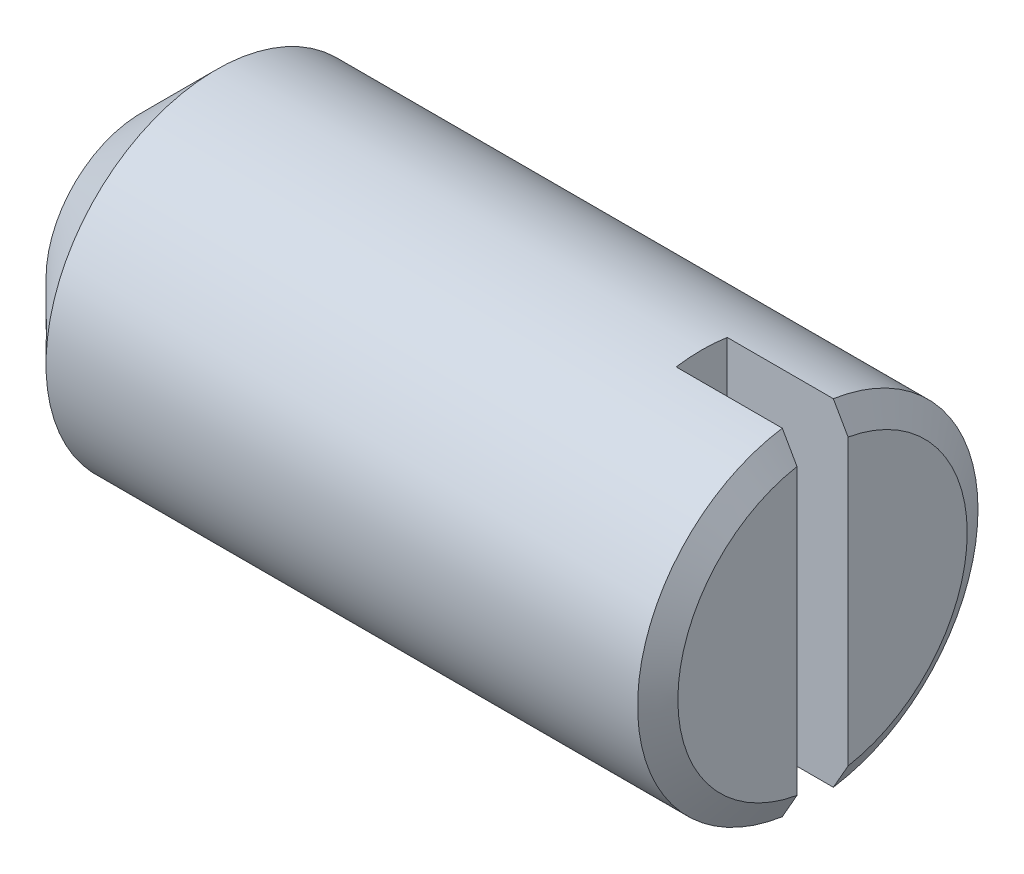
ISO-10303-21;
HEADER;
FILE_DESCRIPTION(('STEP AP214'),'2;1');
FILE_NAME('part.step','',(''),(''),'','','');
FILE_SCHEMA(('AUTOMOTIVE_DESIGN { 1 0 10303 214 1 1 1 1 }'));
ENDSEC;
DATA;
#1=APPLICATION_CONTEXT('core data for automotive mechanical design processes');
#2=APPLICATION_PROTOCOL_DEFINITION('international standard','automotive_design',2000,#1);
#3=PRODUCT_CONTEXT('',#1,'mechanical');
#4=PRODUCT('Part','Part','',(#3));
#5=PRODUCT_RELATED_PRODUCT_CATEGORY('part','',(#4));
#6=PRODUCT_DEFINITION_FORMATION('','',#4);
#7=PRODUCT_DEFINITION_CONTEXT('part definition',#1,'design');
#8=PRODUCT_DEFINITION('design','',#6,#7);
#9=PRODUCT_DEFINITION_SHAPE('','',#8);
#10=(LENGTH_UNIT() NAMED_UNIT(*) SI_UNIT(.MILLI.,.METRE.));
#11=(NAMED_UNIT(*) PLANE_ANGLE_UNIT() SI_UNIT($,.RADIAN.));
#12=(NAMED_UNIT(*) SI_UNIT($,.STERADIAN.) SOLID_ANGLE_UNIT());
#13=UNCERTAINTY_MEASURE_WITH_UNIT(LENGTH_MEASURE(1.E-05),#10,'distance_accuracy_value','');
#14=(GEOMETRIC_REPRESENTATION_CONTEXT(3) GLOBAL_UNCERTAINTY_ASSIGNED_CONTEXT((#13)) GLOBAL_UNIT_ASSIGNED_CONTEXT((#10,
#11,#12)) REPRESENTATION_CONTEXT('',''));
#15=CARTESIAN_POINT('',(0.,0.,0.));
#16=DIRECTION('',(0.,0.,1.));
#17=DIRECTION('',(1.,0.,0.));
#18=AXIS2_PLACEMENT_3D('',#15,#16,#17);
#19=CARTESIAN_POINT('',(8.,0.,0.));
#20=DIRECTION('',(-1.,0.,0.));
#21=DIRECTION('',(0.,0.,1.));
#22=AXIS2_PLACEMENT_3D('',#19,#20,#21);
#23=CONICAL_SURFACE('',#22,1.7,1.04719755119659);
#24=CARTESIAN_POINT('',(6.43384577443204,4.40244894630011,0.299999999999992));
#25=CARTESIAN_POINT('',(6.54099986398286,4.21641536933403,0.299999999999993));
#26=CARTESIAN_POINT('',(6.64813596929299,4.03037142123298,0.299999999999993));
#27=CARTESIAN_POINT('',(6.86233649699623,3.6582410423436,0.299999999999994));
#28=CARTESIAN_POINT('',(6.96940091903233,3.47215461134977,0.299999999999995));
#29=CARTESIAN_POINT('',(7.18340645502229,3.09994519405125,0.299999999999996));
#30=CARTESIAN_POINT('',(7.29034758402646,2.91382221640337,0.299999999999996));
#31=CARTESIAN_POINT('',(7.50403787499869,2.54146710787707,0.299999999999997));
#32=CARTESIAN_POINT('',(7.61078703776045,2.35523497745418,0.299999999999998));
#33=CARTESIAN_POINT('',(7.82309426396742,1.98402598556893,0.299999999999999));
#34=CARTESIAN_POINT('',(7.92865510791797,1.79905071693742,0.299999999999999));
#35=CARTESIAN_POINT('',(8.08636037949641,1.52120965777465,0.3));
#36=CARTESIAN_POINT('',(8.1388262889448,1.42852673941122,0.3));
#37=CARTESIAN_POINT('',(8.243367594063,1.24294434814013,0.300000000000001));
#38=CARTESIAN_POINT('',(8.29544299951034,1.15004488073133,0.300000000000001));
#39=CARTESIAN_POINT('',(8.39902801053093,0.963584343852958,0.300000000000002));
#40=CARTESIAN_POINT('',(8.45053561068544,0.870022148124238,0.300000000000002));
#41=CARTESIAN_POINT('',(8.52647655275933,0.728971609484221,0.300000000000002));
#42=CARTESIAN_POINT('',(8.5515690573268,0.681838961785801,0.300000000000002));
#43=CARTESIAN_POINT('',(8.60098924091676,0.587177617069353,0.300000000000002));
#44=CARTESIAN_POINT('',(8.62531702474956,0.539648975464611,0.300000000000003));
#45=CARTESIAN_POINT('',(8.66082604510436,0.467590225669644,0.300000000000003));
#46=CARTESIAN_POINT('',(8.67255043924786,0.443329175234501,0.300000000000003));
#47=CARTESIAN_POINT('',(8.6954497341713,0.394550260257357,0.300000000000003));
#48=CARTESIAN_POINT('',(8.70662467543611,0.370032414798532,0.300000000000003));
#49=CARTESIAN_POINT('',(8.72818404469195,0.320568263408581,0.300000000000003));
#50=CARTESIAN_POINT('',(8.73856634298754,0.29562100964,0.300000000000003));
#51=CARTESIAN_POINT('',(8.75804469462508,0.245239943278828,0.300000000000003));
#52=CARTESIAN_POINT('',(8.76714117598854,0.219806295812293,0.300000000000003));
#53=CARTESIAN_POINT('',(8.78574944940381,0.160440993195013,0.300000000000003));
#54=CARTESIAN_POINT('',(8.79455589633127,0.126264122572378,0.300000000000003));
#55=CARTESIAN_POINT('',(8.80329578205414,0.0743921980619298,0.300000000000003));
#56=CARTESIAN_POINT('',(8.80546423348747,0.0570819807733824,0.300000000000003));
#57=CARTESIAN_POINT('',(8.80809548406505,0.022331407032104,0.300000000000003));
#58=CARTESIAN_POINT('',(8.80855877140002,0.00489108926039829,0.300000000000003));
#59=CARTESIAN_POINT('',(8.80771899321109,-0.029991484685728,0.300000000000003));
#60=CARTESIAN_POINT('',(8.80641122145873,-0.0474336223868381,0.300000000000003));
#61=CARTESIAN_POINT('',(8.80218582178616,-0.0821235099255909,0.300000000000003));
#62=CARTESIAN_POINT('',(8.79926736028687,-0.0993711543869434,0.300000000000003));
#63=CARTESIAN_POINT('',(8.79207945037896,-0.133777027234762,0.300000000000003));
#64=CARTESIAN_POINT('',(8.7877951879204,-0.150932072423952,0.300000000000003));
#65=CARTESIAN_POINT('',(8.77820108928469,-0.184946222304824,0.300000000000003));
#66=CARTESIAN_POINT('',(8.77289127583489,-0.201805333545701,0.300000000000003));
#67=CARTESIAN_POINT('',(8.75484530489759,-0.254925171469467,0.300000000000003));
#68=CARTESIAN_POINT('',(8.74071441973956,-0.290705223590161,0.300000000000003));
#69=CARTESIAN_POINT('',(8.71062400242476,-0.361494745894207,0.300000000000003));
#70=CARTESIAN_POINT('',(8.69466250278299,-0.396503337856948,0.300000000000003));
#71=CARTESIAN_POINT('',(8.66166899240292,-0.466113002783628,0.300000000000003));
#72=CARTESIAN_POINT('',(8.64463452397595,-0.500712907385385,0.300000000000002));
#73=CARTESIAN_POINT('',(8.60993890010029,-0.569598273931734,0.300000000000002));
#74=CARTESIAN_POINT('',(8.5922776770247,-0.603883701438852,0.300000000000002));
#75=CARTESIAN_POINT('',(8.53859664435761,-0.706644547549245,0.300000000000002));
#76=CARTESIAN_POINT('',(8.50198532248893,-0.774810057875359,0.300000000000002));
#77=CARTESIAN_POINT('',(8.4280979388698,-0.910626011246942,0.300000000000001));
#78=CARTESIAN_POINT('',(8.39082310494904,-0.978277130015775,0.300000000000001));
#79=CARTESIAN_POINT('',(8.31369052620455,-1.11726496030411,0.300000000000001));
#80=CARTESIAN_POINT('',(8.27380827261231,-1.18858807897555,0.3));
#81=CARTESIAN_POINT('',(8.19377418393951,-1.33108241039772,0.3));
#82=CARTESIAN_POINT('',(8.15362234900318,-1.40225362322971,0.3));
#83=CARTESIAN_POINT('',(8.03291197029119,-1.61562845677563,0.299999999999999));
#84=CARTESIAN_POINT('',(7.95210086275345,-1.7576891435005,0.299999999999998));
#85=CARTESIAN_POINT('',(7.79010047747201,-2.04174752172152,0.299999999999998));
#86=CARTESIAN_POINT('',(7.70891094549143,-2.18374506786865,0.299999999999997));
#87=CARTESIAN_POINT('',(7.54635364086865,-2.46763597612371,0.299999999999996));
#88=CARTESIAN_POINT('',(7.46498587026365,-2.60952933939791,0.299999999999996));
#89=CARTESIAN_POINT('',(7.30451857599533,-2.88911302620783,0.299999999999995));
#90=CARTESIAN_POINT('',(7.22542216939588,-3.02680513982857,0.299999999999994));
#91=CARTESIAN_POINT('',(7.06716086832774,-3.30215069522887,0.299999999999994));
#92=CARTESIAN_POINT('',(6.98799597360091,-3.43980413686005,0.299999999999993));
#93=CARTESIAN_POINT('',(6.82968603599213,-3.71496754148606,0.299999999999992));
#94=CARTESIAN_POINT('',(6.75054103291849,-3.85247752738738,0.299999999999992));
#95=CARTESIAN_POINT('',(6.59221641549057,-4.12747684994086,0.299999999999991));
#96=CARTESIAN_POINT('',(6.51303680127426,-4.26496618667245,0.29999999999999));
#97=CARTESIAN_POINT('',(6.43384577443204,-4.40244894630011,0.29999999999999));
#98=B_SPLINE_CURVE_WITH_KNOTS('',3,(#24,#25,#26,#27,#28,#29,#30,#31,#32,#33,#34,#35,#36,#37,#38,
#39,#40,#41,#42,#43,#44,#45,#46,#47,#48,#49,#50,#51,#52,#53,#54,#55,#56,#57,#58,#59,#60,#61,#62,
#63,#64,#65,#66,#67,#68,#69,#70,#71,#72,#73,#74,#75,#76,#77,#78,#79,#80,#81,#82,#83,#84,#85,#86,
#87,#88,#89,#90,#91,#92,#93,#94,#95,#96,#97),.UNSPECIFIED.,.F.,.F.,(4,2,2,2,2,2,2,2,2,2,2,2,2,2,
2,2,2,2,2,2,2,2,2,2,2,2,2,2,2,2,2,2,2,2,2,2,4),(0.,0.644060892388608,1.28812496899202,
1.93209966475453,2.57607169180933,3.21499990646721,3.5345067171213,3.85400550099236,
4.17440368691128,4.33458879688482,4.49475185579147,4.57558345391017,4.65640908722862,
4.73744475464583,4.818453383141,4.92394468881427,4.97620855608451,5.0284574589765,
5.08084547545169,5.13326062971658,5.18626483524194,5.23926786627027,5.35455329205823,
5.46996380498466,5.58564902795616,5.70134677155788,5.93345956010062,6.1651801211014,
6.41032815199519,6.65547605174483,7.14578604513707,7.63649505432983,8.12719848390084,
8.60357881679363,9.07996095302559,9.55594030637969,10.031917779299),.UNSPECIFIED.);
#99=CARTESIAN_POINT('',(7.82679491924311,1.97737199332852,0.299999999999999));
#100=VERTEX_POINT('',#99);
#101=CARTESIAN_POINT('',(8.,1.67332005306815,0.3));
#102=VERTEX_POINT('',#101);
#103=EDGE_CURVE('E104',#100,#102,#98,.T.);
#104=ORIENTED_EDGE('',*,*,#103,.F.);
#105=CARTESIAN_POINT('',(7.82679491924311,0.,0.));
#106=DIRECTION('',(1.,0.,0.));
#107=DIRECTION('',(0.,0.,-1.));
#108=AXIS2_PLACEMENT_3D('',#105,#106,#107);
#109=CIRCLE('',#108,2.);
#110=CARTESIAN_POINT('',(7.82679491924311,-1.97737199332852,0.299999999999998));
#111=VERTEX_POINT('',#110);
#112=EDGE_CURVE('E109',#100,#111,#109,.T.);
#113=ORIENTED_EDGE('',*,*,#112,.T.);
#114=CARTESIAN_POINT('',(8.,-1.67332005306815,0.299999999999999));
#115=VERTEX_POINT('',#114);
#116=EDGE_CURVE('E149',#115,#111,#98,.T.);
#117=ORIENTED_EDGE('',*,*,#116,.F.);
#118=CARTESIAN_POINT('',(8.,0.,0.));
#119=DIRECTION('',(1.,0.,0.));
#120=DIRECTION('',(0.,0.,-1.));
#121=AXIS2_PLACEMENT_3D('',#118,#119,#120);
#122=CIRCLE('',#121,1.7);
#123=EDGE_CURVE('E101',#102,#115,#122,.T.);
#124=ORIENTED_EDGE('',*,*,#123,.F.);
#125=EDGE_LOOP('',(#104,#113,#117,#124));
#126=FACE_BOUND('',#125,.T.);
#127=ADVANCED_FACE('F29',(#126),#23,.T.);
#128=CARTESIAN_POINT('',(8.,0.,-1.7));
#129=DIRECTION('',(1.,0.,0.));
#130=DIRECTION('',(0.,0.,-1.));
#131=AXIS2_PLACEMENT_3D('',#128,#129,#130);
#132=PLANE('',#131);
#133=DIRECTION('',(0.,-1.,0.));
#134=VECTOR('',#133,1.);
#135=CARTESIAN_POINT('',(8.,0.,0.299999999999999));
#136=LINE('',#135,#134);
#137=EDGE_CURVE('E88',#102,#115,#136,.T.);
#138=ORIENTED_EDGE('',*,*,#137,.F.);
#139=ORIENTED_EDGE('',*,*,#123,.T.);
#140=EDGE_LOOP('',(#138,#139));
#141=FACE_BOUND('',#140,.T.);
#142=ADVANCED_FACE('F158',(#141),#132,.T.);
#143=CARTESIAN_POINT('',(0.,0.,0.));
#144=DIRECTION('',(-1.,0.,0.));
#145=DIRECTION('',(0.,0.,1.));
#146=AXIS2_PLACEMENT_3D('',#143,#144,#145);
#147=PLANE('',#146);
#148=CARTESIAN_POINT('',(0.,0.,0.));
#149=DIRECTION('',(1.,0.,0.));
#150=DIRECTION('',(0.,0.,-1.));
#151=AXIS2_PLACEMENT_3D('',#148,#149,#150);
#152=CIRCLE('',#151,1.125);
#153=CARTESIAN_POINT('',(0.,0.,-1.125));
#154=VERTEX_POINT('',#153);
#155=EDGE_CURVE('E89',#154,#154,#152,.T.);
#156=ORIENTED_EDGE('',*,*,#155,.F.);
#157=EDGE_LOOP('',(#156));
#158=FACE_BOUND('',#157,.T.);
#159=ADVANCED_FACE('F31',(#158),#147,.T.);
#160=CARTESIAN_POINT('',(0.875000000000009,0.,0.));
#161=DIRECTION('',(1.,0.,0.));
#162=DIRECTION('',(0.,0.,-1.));
#163=AXIS2_PLACEMENT_3D('',#160,#161,#162);
#164=CONICAL_SURFACE('',#163,2.,0.785398163397443);
#165=ORIENTED_EDGE('',*,*,#155,.T.);
#166=EDGE_LOOP('',(#165));
#167=FACE_BOUND('',#166,.T.);
#168=CARTESIAN_POINT('',(0.875000000000009,0.,0.));
#169=DIRECTION('',(1.,0.,0.));
#170=DIRECTION('',(0.,0.,-1.));
#171=AXIS2_PLACEMENT_3D('',#168,#169,#170);
#172=CIRCLE('',#171,2.);
#173=CARTESIAN_POINT('',(0.875000000000009,0.,-2.));
#174=VERTEX_POINT('',#173);
#175=EDGE_CURVE('E110',#174,#174,#172,.T.);
#176=ORIENTED_EDGE('',*,*,#175,.F.);
#177=EDGE_LOOP('',(#176));
#178=FACE_BOUND('',#177,.T.);
#179=ADVANCED_FACE('F170',(#167,#178),#164,.T.);
#180=CARTESIAN_POINT('',(8.,0.,0.));
#181=DIRECTION('',(1.,0.,0.));
#182=DIRECTION('',(0.,0.,-1.));
#183=AXIS2_PLACEMENT_3D('',#180,#181,#182);
#184=CYLINDRICAL_SURFACE('',#183,2.);
#185=DIRECTION('',(1.,0.,0.));
#186=VECTOR('',#185,1.);
#187=CARTESIAN_POINT('',(8.,-1.97737199332852,0.299999999999999));
#188=LINE('',#187,#186);
#189=CARTESIAN_POINT('',(6.58,-1.97737199332852,0.299999999999991));
#190=VERTEX_POINT('',#189);
#191=EDGE_CURVE('E129',#111,#190,#188,.F.);
#192=ORIENTED_EDGE('',*,*,#191,.F.);
#193=ORIENTED_EDGE('',*,*,#112,.F.);
#194=DIRECTION('',(1.,0.,0.));
#195=VECTOR('',#194,1.);
#196=CARTESIAN_POINT('',(8.,1.97737199332852,0.3));
#197=LINE('',#196,#195);
#198=CARTESIAN_POINT('',(6.58,1.97737199332852,0.299999999999992));
#199=VERTEX_POINT('',#198);
#200=EDGE_CURVE('E52',#199,#100,#197,.T.);
#201=ORIENTED_EDGE('',*,*,#200,.F.);
#202=CARTESIAN_POINT('',(6.58,0.,0.));
#203=DIRECTION('',(1.,0.,0.));
#204=DIRECTION('',(0.,0.,-1.));
#205=AXIS2_PLACEMENT_3D('',#202,#203,#204);
#206=CIRCLE('',#205,2.);
#207=CARTESIAN_POINT('',(6.58,1.97737199332852,-0.300000000000008));
#208=VERTEX_POINT('',#207);
#209=EDGE_CURVE('E33',#199,#208,#206,.F.);
#210=ORIENTED_EDGE('',*,*,#209,.T.);
#211=DIRECTION('',(1.,0.,0.));
#212=VECTOR('',#211,1.);
#213=CARTESIAN_POINT('',(8.,1.97737199332852,-0.3));
#214=LINE('',#213,#212);
#215=CARTESIAN_POINT('',(7.82679491924311,1.97737199332852,-0.300000000000001));
#216=VERTEX_POINT('',#215);
#217=EDGE_CURVE('E97',#216,#208,#214,.F.);
#218=ORIENTED_EDGE('',*,*,#217,.F.);
#219=CARTESIAN_POINT('',(7.82679491924311,-1.97737199332852,-0.300000000000001));
#220=VERTEX_POINT('',#219);
#221=EDGE_CURVE('E96',#220,#216,#109,.T.);
#222=ORIENTED_EDGE('',*,*,#221,.F.);
#223=DIRECTION('',(1.,0.,0.));
#224=VECTOR('',#223,1.);
#225=CARTESIAN_POINT('',(8.,-1.97737199332852,-0.3));
#226=LINE('',#225,#224);
#227=CARTESIAN_POINT('',(6.58,-1.97737199332852,-0.300000000000008));
#228=VERTEX_POINT('',#227);
#229=EDGE_CURVE('E153',#228,#220,#226,.T.);
#230=ORIENTED_EDGE('',*,*,#229,.F.);
#231=EDGE_CURVE('E11',#228,#190,#206,.F.);
#232=ORIENTED_EDGE('',*,*,#231,.T.);
#233=EDGE_LOOP('',(#192,#193,#201,#210,#218,#222,#230,#232));
#234=FACE_BOUND('',#233,.T.);
#235=ORIENTED_EDGE('',*,*,#175,.T.);
#236=EDGE_LOOP('',(#235));
#237=FACE_BOUND('',#236,.T.);
#238=ADVANCED_FACE('F119',(#234,#237),#184,.T.);
#239=CARTESIAN_POINT('',(6.43384577443204,-4.40244894630011,-0.300000000000008));
#240=CARTESIAN_POINT('',(6.54099986398286,-4.21641536933403,-0.300000000000008));
#241=CARTESIAN_POINT('',(6.64813596929298,-4.03037142123299,-0.300000000000007));
#242=CARTESIAN_POINT('',(6.86233649699623,-3.6582410423436,-0.300000000000006));
#243=CARTESIAN_POINT('',(6.96940091903232,-3.47215461134978,-0.300000000000006));
#244=CARTESIAN_POINT('',(7.18340645502228,-3.09994519405126,-0.300000000000005));
#245=CARTESIAN_POINT('',(7.29034758402645,-2.91382221640338,-0.300000000000004));
#246=CARTESIAN_POINT('',(7.50403787499868,-2.54146710787708,-0.300000000000003));
#247=CARTESIAN_POINT('',(7.61078703776044,-2.3552349774542,-0.300000000000002));
#248=CARTESIAN_POINT('',(7.82309426396741,-1.98402598556895,-0.300000000000001));
#249=CARTESIAN_POINT('',(7.92865510791796,-1.79905071693744,-0.300000000000001));
#250=CARTESIAN_POINT('',(8.0863603794964,-1.52120965777466,-0.3));
#251=CARTESIAN_POINT('',(8.1388262889448,-1.42852673941124,-0.3));
#252=CARTESIAN_POINT('',(8.24336759406299,-1.24294434814014,-0.299999999999999));
#253=CARTESIAN_POINT('',(8.29544299951033,-1.15004488073134,-0.299999999999999));
#254=CARTESIAN_POINT('',(8.39902801053093,-0.963584343852968,-0.299999999999998));
#255=CARTESIAN_POINT('',(8.45053561068544,-0.870022148124248,-0.299999999999998));
#256=CARTESIAN_POINT('',(8.52647655275933,-0.72897160948423,-0.299999999999997));
#257=CARTESIAN_POINT('',(8.5515690573268,-0.681838961785811,-0.299999999999997));
#258=CARTESIAN_POINT('',(8.60098924091676,-0.587177617069363,-0.299999999999997));
#259=CARTESIAN_POINT('',(8.62531702474956,-0.539648975464621,-0.299999999999997));
#260=CARTESIAN_POINT('',(8.66082604510436,-0.467590225669654,-0.299999999999997));
#261=CARTESIAN_POINT('',(8.67255043924786,-0.443329175234511,-0.299999999999997));
#262=CARTESIAN_POINT('',(8.6954497341713,-0.394550260257367,-0.299999999999997));
#263=CARTESIAN_POINT('',(8.70662467543611,-0.370032414798542,-0.299999999999997));
#264=CARTESIAN_POINT('',(8.72818404469195,-0.32056826340859,-0.299999999999996));
#265=CARTESIAN_POINT('',(8.73856634298754,-0.295621009640009,-0.299999999999996));
#266=CARTESIAN_POINT('',(8.75804469462508,-0.245239943278837,-0.299999999999996));
#267=CARTESIAN_POINT('',(8.76714117598854,-0.219806295812302,-0.299999999999996));
#268=CARTESIAN_POINT('',(8.78574944940381,-0.160440993195022,-0.299999999999996));
#269=CARTESIAN_POINT('',(8.79455589633128,-0.126264122572388,-0.299999999999996));
#270=CARTESIAN_POINT('',(8.80329578205415,-0.0743921980619397,-0.299999999999996));
#271=CARTESIAN_POINT('',(8.80546423348748,-0.0570819807733928,-0.299999999999996));
#272=CARTESIAN_POINT('',(8.80809548406506,-0.0223314070321156,-0.299999999999996));
#273=CARTESIAN_POINT('',(8.80855877140003,-0.00489108926041064,-0.299999999999996));
#274=CARTESIAN_POINT('',(8.8077189932111,0.0299914846857147,-0.299999999999996));
#275=CARTESIAN_POINT('',(8.80641122145874,0.0474336223868245,-0.299999999999996));
#276=CARTESIAN_POINT('',(8.80218582178616,0.0821235099255769,-0.299999999999996));
#277=CARTESIAN_POINT('',(8.79926736028688,0.0993711543869292,-0.299999999999996));
#278=CARTESIAN_POINT('',(8.79207945037897,0.133777027234748,-0.299999999999996));
#279=CARTESIAN_POINT('',(8.78779518792041,0.150932072423937,-0.299999999999996));
#280=CARTESIAN_POINT('',(8.7782010892847,0.18494622230481,-0.299999999999996));
#281=CARTESIAN_POINT('',(8.7728912758349,0.201805333545686,-0.299999999999996));
#282=CARTESIAN_POINT('',(8.7548453048976,0.254925171469449,-0.299999999999996));
#283=CARTESIAN_POINT('',(8.74071441973957,0.290705223590141,-0.299999999999996));
#284=CARTESIAN_POINT('',(8.71062400242477,0.361494745894183,-0.299999999999996));
#285=CARTESIAN_POINT('',(8.694662502783,0.396503337856922,-0.299999999999997));
#286=CARTESIAN_POINT('',(8.66166899240294,0.466113002783596,-0.299999999999997));
#287=CARTESIAN_POINT('',(8.64463452397597,0.50071290738535,-0.299999999999997));
#288=CARTESIAN_POINT('',(8.60993890010031,0.569598273931695,-0.299999999999997));
#289=CARTESIAN_POINT('',(8.59227767702472,0.603883701438811,-0.299999999999997));
#290=CARTESIAN_POINT('',(8.53859664435764,0.706644547549197,-0.299999999999997));
#291=CARTESIAN_POINT('',(8.50198532248896,0.774810057875307,-0.299999999999998));
#292=CARTESIAN_POINT('',(8.42809793886983,0.91062601124688,-0.299999999999998));
#293=CARTESIAN_POINT('',(8.39082310494907,0.978277130015708,-0.299999999999998));
#294=CARTESIAN_POINT('',(8.31369052620459,1.11726496030405,-0.299999999999999));
#295=CARTESIAN_POINT('',(8.27380827261235,1.18858807897548,-0.299999999999999));
#296=CARTESIAN_POINT('',(8.19377418393955,1.33108241039766,-0.299999999999999));
#297=CARTESIAN_POINT('',(8.15362234900321,1.40225362322965,-0.299999999999999));
#298=CARTESIAN_POINT('',(8.03291197029122,1.61562845677558,-0.3));
#299=CARTESIAN_POINT('',(7.95210086275348,1.75768914350044,-0.3));
#300=CARTESIAN_POINT('',(7.79010047747203,2.04174752172147,-0.300000000000001));
#301=CARTESIAN_POINT('',(7.70891094549145,2.18374506786861,-0.300000000000002));
#302=CARTESIAN_POINT('',(7.54635364086867,2.46763597612368,-0.300000000000003));
#303=CARTESIAN_POINT('',(7.46498587026367,2.60952933939788,-0.300000000000003));
#304=CARTESIAN_POINT('',(7.30451857599535,2.8891130262078,-0.300000000000004));
#305=CARTESIAN_POINT('',(7.2254221693959,3.02680513982855,-0.300000000000004));
#306=CARTESIAN_POINT('',(7.06716086832775,3.30215069522885,-0.300000000000005));
#307=CARTESIAN_POINT('',(6.98799597360092,3.43980413686004,-0.300000000000006));
#308=CARTESIAN_POINT('',(6.82968603599214,3.71496754148605,-0.300000000000006));
#309=CARTESIAN_POINT('',(6.7505410329185,3.85247752738737,-0.300000000000007));
#310=CARTESIAN_POINT('',(6.59221641549057,4.12747684994086,-0.300000000000008));
#311=CARTESIAN_POINT('',(6.51303680127426,4.26496618667245,-0.300000000000008));
#312=CARTESIAN_POINT('',(6.43384577443204,4.40244894630011,-0.300000000000008));
#313=B_SPLINE_CURVE_WITH_KNOTS('',3,(#239,#240,#241,#242,#243,#244,#245,#246,#247,#248,#249,
#250,#251,#252,#253,#254,#255,#256,#257,#258,#259,#260,#261,#262,#263,#264,#265,#266,#267,#268,
#269,#270,#271,#272,#273,#274,#275,#276,#277,#278,#279,#280,#281,#282,#283,#284,#285,#286,#287,
#288,#289,#290,#291,#292,#293,#294,#295,#296,#297,#298,#299,#300,#301,#302,#303,#304,#305,#306,
#307,#308,#309,#310,#311,#312),.UNSPECIFIED.,.F.,.F.,(4,2,2,2,2,2,2,2,2,2,2,2,2,2,2,2,2,2,2,2,2,
2,2,2,2,2,2,2,2,2,2,2,2,2,2,2,4),(0.,0.644060892388602,1.28812496899201,1.93209966475452,
2.57607169180931,3.21499990646719,3.53450671712129,3.85400550099235,4.17440368691127,
4.33458879688481,4.49475185579146,4.57558345391016,4.65640908722861,4.73744475464582,
4.81845338314099,4.92394468881427,4.9762085560845,5.02845745897649,5.08084547545168,
5.13326062971657,5.18626483524193,5.23926786627025,5.35455329205821,5.46996380498464,
5.58564902795612,5.70134677155784,5.93345956010056,6.16518012110132,6.41032815199512,
6.65547605174476,7.14578604513702,7.63649505432979,8.12719848390081,8.60357881679361,
9.07996095302557,9.55594030637968,10.031917779299),.UNSPECIFIED.);
#314=CARTESIAN_POINT('',(8.,-1.67332005306815,-0.3));
#315=VERTEX_POINT('',#314);
#316=EDGE_CURVE('E44',#220,#315,#313,.T.);
#317=ORIENTED_EDGE('',*,*,#316,.F.);
#318=ORIENTED_EDGE('',*,*,#221,.T.);
#319=CARTESIAN_POINT('',(8.,1.67332005306815,-0.3));
#320=VERTEX_POINT('',#319);
#321=EDGE_CURVE('E83',#320,#216,#313,.T.);
#322=ORIENTED_EDGE('',*,*,#321,.F.);
#323=EDGE_CURVE('E94',#315,#320,#122,.T.);
#324=ORIENTED_EDGE('',*,*,#323,.F.);
#325=EDGE_LOOP('',(#317,#318,#322,#324));
#326=FACE_BOUND('',#325,.T.);
#327=ADVANCED_FACE('F93',(#326),#23,.T.);
#328=DIRECTION('',(0.,1.,0.));
#329=VECTOR('',#328,1.);
#330=CARTESIAN_POINT('',(8.,0.,-0.3));
#331=LINE('',#330,#329);
#332=EDGE_CURVE('E80',#315,#320,#331,.T.);
#333=ORIENTED_EDGE('',*,*,#332,.F.);
#334=ORIENTED_EDGE('',*,*,#323,.T.);
#335=EDGE_LOOP('',(#333,#334));
#336=FACE_BOUND('',#335,.T.);
#337=ADVANCED_FACE('F100',(#336),#132,.T.);
#338=CARTESIAN_POINT('',(6.58,2.,0.299999999999992));
#339=DIRECTION('',(0.,0.,1.));
#340=DIRECTION('',(1.,0.,0.));
#341=AXIS2_PLACEMENT_3D('',#338,#339,#340);
#342=PLANE('',#341);
#343=ORIENTED_EDGE('',*,*,#200,.T.);
#344=ORIENTED_EDGE('',*,*,#103,.T.);
#345=ORIENTED_EDGE('',*,*,#137,.T.);
#346=ORIENTED_EDGE('',*,*,#116,.T.);
#347=ORIENTED_EDGE('',*,*,#191,.T.);
#348=DIRECTION('',(0.,-1.,0.));
#349=VECTOR('',#348,1.);
#350=CARTESIAN_POINT('',(6.58,2.,0.299999999999992));
#351=LINE('',#350,#349);
#352=EDGE_CURVE('E126',#199,#190,#351,.T.);
#353=ORIENTED_EDGE('',*,*,#352,.F.);
#354=EDGE_LOOP('',(#343,#344,#345,#346,#347,#353));
#355=FACE_BOUND('',#354,.T.);
#356=ADVANCED_FACE('F128',(#355),#342,.F.);
#357=CARTESIAN_POINT('',(6.58,2.,-0.300000000000008));
#358=DIRECTION('',(0.,0.,-1.));
#359=DIRECTION('',(-1.,0.,0.));
#360=AXIS2_PLACEMENT_3D('',#357,#358,#359);
#361=PLANE('',#360);
#362=ORIENTED_EDGE('',*,*,#229,.T.);
#363=ORIENTED_EDGE('',*,*,#316,.T.);
#364=ORIENTED_EDGE('',*,*,#332,.T.);
#365=ORIENTED_EDGE('',*,*,#321,.T.);
#366=ORIENTED_EDGE('',*,*,#217,.T.);
#367=DIRECTION('',(0.,1.,0.));
#368=VECTOR('',#367,1.);
#369=CARTESIAN_POINT('',(6.58,2.,-0.300000000000008));
#370=LINE('',#369,#368);
#371=EDGE_CURVE('E98',#228,#208,#370,.T.);
#372=ORIENTED_EDGE('',*,*,#371,.F.);
#373=EDGE_LOOP('',(#362,#363,#364,#365,#366,#372));
#374=FACE_BOUND('',#373,.T.);
#375=ADVANCED_FACE('F82',(#374),#361,.F.);
#376=CARTESIAN_POINT('',(6.58,-2.,0.299999999999991));
#377=DIRECTION('',(1.,0.,0.));
#378=DIRECTION('',(0.,0.,-1.));
#379=AXIS2_PLACEMENT_3D('',#376,#377,#378);
#380=PLANE('',#379);
#381=ORIENTED_EDGE('',*,*,#371,.T.);
#382=ORIENTED_EDGE('',*,*,#209,.F.);
#383=ORIENTED_EDGE('',*,*,#352,.T.);
#384=ORIENTED_EDGE('',*,*,#231,.F.);
#385=EDGE_LOOP('',(#381,#382,#383,#384));
#386=FACE_BOUND('',#385,.T.);
#387=ADVANCED_FACE('F125',(#386),#380,.T.);
#388=CLOSED_SHELL('',(#127,#142,#159,#179,#238,#327,#337,#356,#375,#387));
#389=MANIFOLD_SOLID_BREP('B2',#388);
#390=ADVANCED_BREP_SHAPE_REPRESENTATION('',(#18,#389),#14);
#391=SHAPE_DEFINITION_REPRESENTATION(#9,#390);
ENDSEC;
END-ISO-10303-21;
